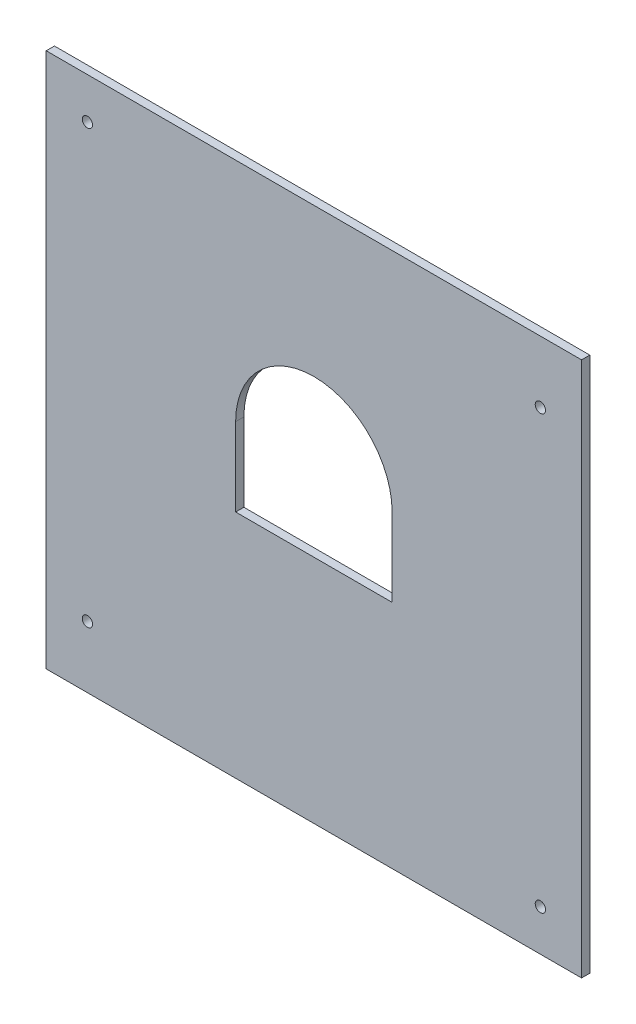
ISO-10303-21;
HEADER;
FILE_DESCRIPTION(('STEP AP214'),'2;1');
FILE_NAME('part.step','',(''),(''),'','','');
FILE_SCHEMA(('AUTOMOTIVE_DESIGN { 1 0 10303 214 1 1 1 1 }'));
ENDSEC;
DATA;
#1=APPLICATION_CONTEXT('core data for automotive mechanical design processes');
#2=APPLICATION_PROTOCOL_DEFINITION('international standard','automotive_design',2000,#1);
#3=PRODUCT_CONTEXT('',#1,'mechanical');
#4=PRODUCT('Part','Part','',(#3));
#5=PRODUCT_RELATED_PRODUCT_CATEGORY('part','',(#4));
#6=PRODUCT_DEFINITION_FORMATION('','',#4);
#7=PRODUCT_DEFINITION_CONTEXT('part definition',#1,'design');
#8=PRODUCT_DEFINITION('design','',#6,#7);
#9=PRODUCT_DEFINITION_SHAPE('','',#8);
#10=(LENGTH_UNIT() NAMED_UNIT(*) SI_UNIT(.MILLI.,.METRE.));
#11=(NAMED_UNIT(*) PLANE_ANGLE_UNIT() SI_UNIT($,.RADIAN.));
#12=(NAMED_UNIT(*) SI_UNIT($,.STERADIAN.) SOLID_ANGLE_UNIT());
#13=UNCERTAINTY_MEASURE_WITH_UNIT(LENGTH_MEASURE(1.E-05),#10,'distance_accuracy_value','');
#14=(GEOMETRIC_REPRESENTATION_CONTEXT(3) GLOBAL_UNCERTAINTY_ASSIGNED_CONTEXT((#13)) GLOBAL_UNIT_ASSIGNED_CONTEXT((#10,
#11,#12)) REPRESENTATION_CONTEXT('',''));
#15=CARTESIAN_POINT('',(0.,0.,0.));
#16=DIRECTION('',(0.,0.,1.));
#17=DIRECTION('',(1.,0.,0.));
#18=AXIS2_PLACEMENT_3D('',#15,#16,#17);
#19=CARTESIAN_POINT('',(0.,0.,2.));
#20=DIRECTION('',(0.,0.,-1.));
#21=DIRECTION('',(-1.,0.,0.));
#22=AXIS2_PLACEMENT_3D('',#19,#20,#21);
#23=PLANE('',#22);
#24=DIRECTION('',(0.,1.,0.));
#25=VECTOR('',#24,1.);
#26=CARTESIAN_POINT('',(65.,-65.,2.));
#27=LINE('',#26,#25);
#28=CARTESIAN_POINT('',(65.,-65.,2.));
#29=VERTEX_POINT('',#28);
#30=CARTESIAN_POINT('',(65.,65.,2.));
#31=VERTEX_POINT('',#30);
#32=EDGE_CURVE('E139',#29,#31,#27,.T.);
#33=ORIENTED_EDGE('',*,*,#32,.T.);
#34=DIRECTION('',(-1.,0.,0.));
#35=VECTOR('',#34,1.);
#36=CARTESIAN_POINT('',(-65.,65.,2.));
#37=LINE('',#36,#35);
#38=CARTESIAN_POINT('',(-65.,65.,2.));
#39=VERTEX_POINT('',#38);
#40=EDGE_CURVE('E142',#31,#39,#37,.T.);
#41=ORIENTED_EDGE('',*,*,#40,.T.);
#42=DIRECTION('',(0.,-1.,0.));
#43=VECTOR('',#42,1.);
#44=CARTESIAN_POINT('',(-65.,-65.,2.));
#45=LINE('',#44,#43);
#46=CARTESIAN_POINT('',(-65.,-65.,2.));
#47=VERTEX_POINT('',#46);
#48=EDGE_CURVE('E145',#39,#47,#45,.T.);
#49=ORIENTED_EDGE('',*,*,#48,.T.);
#50=DIRECTION('',(1.,0.,0.));
#51=VECTOR('',#50,1.);
#52=CARTESIAN_POINT('',(-65.,-65.,2.));
#53=LINE('',#52,#51);
#54=EDGE_CURVE('E147',#47,#29,#53,.T.);
#55=ORIENTED_EDGE('',*,*,#54,.T.);
#56=EDGE_LOOP('',(#33,#41,#49,#55));
#57=FACE_BOUND('',#56,.T.);
#58=CARTESIAN_POINT('',(1.10504890307728E-06,10.0000015377998,2.));
#59=DIRECTION('',(0.,0.,1.));
#60=DIRECTION('',(-1.,0.,0.));
#61=AXIS2_PLACEMENT_3D('',#58,#59,#60);
#62=CIRCLE('',#61,18.9999998235491);
#63=CARTESIAN_POINT('',(19.000000928598,10.0000015377998,2.));
#64=VERTEX_POINT('',#63);
#65=CARTESIAN_POINT('',(-18.9999987185002,10.0000015377998,2.));
#66=VERTEX_POINT('',#65);
#67=EDGE_CURVE('E100',#64,#66,#62,.T.);
#68=ORIENTED_EDGE('',*,*,#67,.F.);
#69=DIRECTION('',(0.,1.,0.));
#70=VECTOR('',#69,1.);
#71=CARTESIAN_POINT('',(19.000000928598,-9.0000071644783,2.));
#72=LINE('',#71,#70);
#73=CARTESIAN_POINT('',(19.000000928598,-9.0000071644783,2.));
#74=VERTEX_POINT('',#73);
#75=EDGE_CURVE('E123',#74,#64,#72,.T.);
#76=ORIENTED_EDGE('',*,*,#75,.F.);
#77=DIRECTION('',(1.,0.,0.));
#78=VECTOR('',#77,1.);
#79=CARTESIAN_POINT('',(-18.9999987185002,-9.0000071644783,2.));
#80=LINE('',#79,#78);
#81=CARTESIAN_POINT('',(-18.9999987185002,-9.0000071644783,2.));
#82=VERTEX_POINT('',#81);
#83=EDGE_CURVE('E121',#82,#74,#80,.T.);
#84=ORIENTED_EDGE('',*,*,#83,.F.);
#85=DIRECTION('',(0.,-1.,0.));
#86=VECTOR('',#85,1.);
#87=CARTESIAN_POINT('',(-18.9999987185002,10.0000015377998,2.));
#88=LINE('',#87,#86);
#89=EDGE_CURVE('E108',#66,#82,#88,.T.);
#90=ORIENTED_EDGE('',*,*,#89,.F.);
#91=EDGE_LOOP('',(#68,#76,#84,#90));
#92=FACE_BOUND('',#91,.T.);
#93=CARTESIAN_POINT('',(-55.,55.,2.));
#94=DIRECTION('',(0.,0.,1.));
#95=DIRECTION('',(1.,0.,0.));
#96=AXIS2_PLACEMENT_3D('',#93,#94,#95);
#97=CIRCLE('',#96,1.25);
#98=CARTESIAN_POINT('',(-53.75,55.,2.));
#99=VERTEX_POINT('',#98);
#100=EDGE_CURVE('E129',#99,#99,#97,.T.);
#101=ORIENTED_EDGE('',*,*,#100,.F.);
#102=EDGE_LOOP('',(#101));
#103=FACE_BOUND('',#102,.T.);
#104=CARTESIAN_POINT('',(55.,50.,2.));
#105=DIRECTION('',(0.,0.,1.));
#106=DIRECTION('',(1.,0.,0.));
#107=AXIS2_PLACEMENT_3D('',#104,#105,#106);
#108=CIRCLE('',#107,1.25);
#109=CARTESIAN_POINT('',(56.25,50.,2.));
#110=VERTEX_POINT('',#109);
#111=EDGE_CURVE('E251',#110,#110,#108,.T.);
#112=ORIENTED_EDGE('',*,*,#111,.F.);
#113=EDGE_LOOP('',(#112));
#114=FACE_BOUND('',#113,.T.);
#115=CARTESIAN_POINT('',(55.,-55.,2.));
#116=DIRECTION('',(0.,0.,1.));
#117=DIRECTION('',(1.,0.,0.));
#118=AXIS2_PLACEMENT_3D('',#115,#116,#117);
#119=CIRCLE('',#118,1.25);
#120=CARTESIAN_POINT('',(56.25,-55.,2.));
#121=VERTEX_POINT('',#120);
#122=EDGE_CURVE('E245',#121,#121,#119,.T.);
#123=ORIENTED_EDGE('',*,*,#122,.F.);
#124=EDGE_LOOP('',(#123));
#125=FACE_BOUND('',#124,.T.);
#126=CARTESIAN_POINT('',(-55.,-50.,2.));
#127=DIRECTION('',(0.,0.,1.));
#128=DIRECTION('',(1.,0.,0.));
#129=AXIS2_PLACEMENT_3D('',#126,#127,#128);
#130=CIRCLE('',#129,1.25);
#131=CARTESIAN_POINT('',(-53.75,-50.,2.));
#132=VERTEX_POINT('',#131);
#133=EDGE_CURVE('E236',#132,#132,#130,.T.);
#134=ORIENTED_EDGE('',*,*,#133,.F.);
#135=EDGE_LOOP('',(#134));
#136=FACE_BOUND('',#135,.T.);
#137=ADVANCED_FACE('F35',(#57,#92,#103,#114,#125,#136),#23,.F.);
#138=CARTESIAN_POINT('',(0.,0.,0.));
#139=DIRECTION('',(0.,0.,-1.));
#140=DIRECTION('',(-1.,0.,0.));
#141=AXIS2_PLACEMENT_3D('',#138,#139,#140);
#142=PLANE('',#141);
#143=CARTESIAN_POINT('',(55.,-55.,0.));
#144=DIRECTION('',(0.,0.,1.));
#145=DIRECTION('',(1.,0.,0.));
#146=AXIS2_PLACEMENT_3D('',#143,#144,#145);
#147=CIRCLE('',#146,1.25);
#148=CARTESIAN_POINT('',(56.25,-55.,0.));
#149=VERTEX_POINT('',#148);
#150=EDGE_CURVE('E242',#149,#149,#147,.T.);
#151=ORIENTED_EDGE('',*,*,#150,.T.);
#152=EDGE_LOOP('',(#151));
#153=FACE_BOUND('',#152,.T.);
#154=CARTESIAN_POINT('',(-55.,55.,0.));
#155=DIRECTION('',(0.,0.,1.));
#156=DIRECTION('',(1.,0.,0.));
#157=AXIS2_PLACEMENT_3D('',#154,#155,#156);
#158=CIRCLE('',#157,1.25);
#159=CARTESIAN_POINT('',(-53.75,55.,0.));
#160=VERTEX_POINT('',#159);
#161=EDGE_CURVE('E254',#160,#160,#158,.T.);
#162=ORIENTED_EDGE('',*,*,#161,.T.);
#163=EDGE_LOOP('',(#162));
#164=FACE_BOUND('',#163,.T.);
#165=DIRECTION('',(0.,1.,0.));
#166=VECTOR('',#165,1.);
#167=CARTESIAN_POINT('',(65.,-65.,0.));
#168=LINE('',#167,#166);
#169=CARTESIAN_POINT('',(65.,-65.,0.));
#170=VERTEX_POINT('',#169);
#171=CARTESIAN_POINT('',(65.,65.,0.));
#172=VERTEX_POINT('',#171);
#173=EDGE_CURVE('E116',#170,#172,#168,.T.);
#174=ORIENTED_EDGE('',*,*,#173,.F.);
#175=DIRECTION('',(1.,0.,0.));
#176=VECTOR('',#175,1.);
#177=CARTESIAN_POINT('',(-65.,-65.,0.));
#178=LINE('',#177,#176);
#179=CARTESIAN_POINT('',(-65.,-65.,0.));
#180=VERTEX_POINT('',#179);
#181=EDGE_CURVE('E143',#180,#170,#178,.T.);
#182=ORIENTED_EDGE('',*,*,#181,.F.);
#183=DIRECTION('',(0.,-1.,0.));
#184=VECTOR('',#183,1.);
#185=CARTESIAN_POINT('',(-65.,-65.,0.));
#186=LINE('',#185,#184);
#187=CARTESIAN_POINT('',(-65.,65.,0.));
#188=VERTEX_POINT('',#187);
#189=EDGE_CURVE('E154',#188,#180,#186,.T.);
#190=ORIENTED_EDGE('',*,*,#189,.F.);
#191=DIRECTION('',(-1.,0.,0.));
#192=VECTOR('',#191,1.);
#193=CARTESIAN_POINT('',(-65.,65.,0.));
#194=LINE('',#193,#192);
#195=EDGE_CURVE('E152',#172,#188,#194,.T.);
#196=ORIENTED_EDGE('',*,*,#195,.F.);
#197=EDGE_LOOP('',(#174,#182,#190,#196));
#198=FACE_BOUND('',#197,.T.);
#199=DIRECTION('',(0.,1.,0.));
#200=VECTOR('',#199,1.);
#201=CARTESIAN_POINT('',(19.000000928598,-9.0000071644783,0.));
#202=LINE('',#201,#200);
#203=CARTESIAN_POINT('',(19.000000928598,-9.0000071644783,0.));
#204=VERTEX_POINT('',#203);
#205=CARTESIAN_POINT('',(19.000000928598,10.0000015377998,0.));
#206=VERTEX_POINT('',#205);
#207=EDGE_CURVE('E109',#204,#206,#202,.T.);
#208=ORIENTED_EDGE('',*,*,#207,.T.);
#209=CARTESIAN_POINT('',(1.10504890307728E-06,10.0000015377998,0.));
#210=DIRECTION('',(0.,0.,1.));
#211=DIRECTION('',(-1.,0.,0.));
#212=AXIS2_PLACEMENT_3D('',#209,#210,#211);
#213=CIRCLE('',#212,18.9999998235491);
#214=CARTESIAN_POINT('',(-18.9999987185002,10.0000015377998,0.));
#215=VERTEX_POINT('',#214);
#216=EDGE_CURVE('E58',#206,#215,#213,.T.);
#217=ORIENTED_EDGE('',*,*,#216,.T.);
#218=DIRECTION('',(0.,-1.,0.));
#219=VECTOR('',#218,1.);
#220=CARTESIAN_POINT('',(-18.9999987185002,10.0000015377998,0.));
#221=LINE('',#220,#219);
#222=CARTESIAN_POINT('',(-18.9999987185002,-9.0000071644783,0.));
#223=VERTEX_POINT('',#222);
#224=EDGE_CURVE('E115',#215,#223,#221,.T.);
#225=ORIENTED_EDGE('',*,*,#224,.T.);
#226=DIRECTION('',(1.,0.,0.));
#227=VECTOR('',#226,1.);
#228=CARTESIAN_POINT('',(-18.9999987185002,-9.0000071644783,0.));
#229=LINE('',#228,#227);
#230=EDGE_CURVE('E131',#223,#204,#229,.T.);
#231=ORIENTED_EDGE('',*,*,#230,.T.);
#232=EDGE_LOOP('',(#208,#217,#225,#231));
#233=FACE_BOUND('',#232,.T.);
#234=CARTESIAN_POINT('',(55.,50.,0.));
#235=DIRECTION('',(0.,0.,1.));
#236=DIRECTION('',(1.,0.,0.));
#237=AXIS2_PLACEMENT_3D('',#234,#235,#236);
#238=CIRCLE('',#237,1.25);
#239=CARTESIAN_POINT('',(56.25,50.,0.));
#240=VERTEX_POINT('',#239);
#241=EDGE_CURVE('E248',#240,#240,#238,.T.);
#242=ORIENTED_EDGE('',*,*,#241,.T.);
#243=EDGE_LOOP('',(#242));
#244=FACE_BOUND('',#243,.T.);
#245=CARTESIAN_POINT('',(-55.,-50.,0.));
#246=DIRECTION('',(0.,0.,1.));
#247=DIRECTION('',(1.,0.,0.));
#248=AXIS2_PLACEMENT_3D('',#245,#246,#247);
#249=CIRCLE('',#248,1.25);
#250=CARTESIAN_POINT('',(-53.75,-50.,0.));
#251=VERTEX_POINT('',#250);
#252=EDGE_CURVE('E239',#251,#251,#249,.T.);
#253=ORIENTED_EDGE('',*,*,#252,.T.);
#254=EDGE_LOOP('',(#253));
#255=FACE_BOUND('',#254,.T.);
#256=ADVANCED_FACE('F172',(#153,#164,#198,#233,#244,#255),#142,.T.);
#257=CARTESIAN_POINT('',(65.,-65.,2.));
#258=DIRECTION('',(-1.,0.,0.));
#259=DIRECTION('',(0.,0.,1.));
#260=AXIS2_PLACEMENT_3D('',#257,#258,#259);
#261=PLANE('',#260);
#262=ORIENTED_EDGE('',*,*,#173,.T.);
#263=DIRECTION('',(0.,0.,-1.));
#264=VECTOR('',#263,1.);
#265=CARTESIAN_POINT('',(65.,65.,2.));
#266=LINE('',#265,#264);
#267=EDGE_CURVE('E11',#31,#172,#266,.T.);
#268=ORIENTED_EDGE('',*,*,#267,.F.);
#269=ORIENTED_EDGE('',*,*,#32,.F.);
#270=DIRECTION('',(0.,0.,-1.));
#271=VECTOR('',#270,1.);
#272=CARTESIAN_POINT('',(65.,-65.,2.));
#273=LINE('',#272,#271);
#274=EDGE_CURVE('E149',#29,#170,#273,.T.);
#275=ORIENTED_EDGE('',*,*,#274,.T.);
#276=EDGE_LOOP('',(#262,#268,#269,#275));
#277=FACE_BOUND('',#276,.T.);
#278=ADVANCED_FACE('F37',(#277),#261,.F.);
#279=CARTESIAN_POINT('',(-65.,65.,2.));
#280=DIRECTION('',(0.,-1.,0.));
#281=DIRECTION('',(0.,0.,-1.));
#282=AXIS2_PLACEMENT_3D('',#279,#280,#281);
#283=PLANE('',#282);
#284=ORIENTED_EDGE('',*,*,#195,.T.);
#285=DIRECTION('',(0.,0.,-1.));
#286=VECTOR('',#285,1.);
#287=CARTESIAN_POINT('',(-65.,65.,2.));
#288=LINE('',#287,#286);
#289=EDGE_CURVE('E43',#39,#188,#288,.T.);
#290=ORIENTED_EDGE('',*,*,#289,.F.);
#291=ORIENTED_EDGE('',*,*,#40,.F.);
#292=ORIENTED_EDGE('',*,*,#267,.T.);
#293=EDGE_LOOP('',(#284,#290,#291,#292));
#294=FACE_BOUND('',#293,.T.);
#295=ADVANCED_FACE('F182',(#294),#283,.F.);
#296=CARTESIAN_POINT('',(-65.,-65.,2.));
#297=DIRECTION('',(1.,0.,0.));
#298=DIRECTION('',(0.,0.,-1.));
#299=AXIS2_PLACEMENT_3D('',#296,#297,#298);
#300=PLANE('',#299);
#301=ORIENTED_EDGE('',*,*,#189,.T.);
#302=DIRECTION('',(0.,0.,-1.));
#303=VECTOR('',#302,1.);
#304=CARTESIAN_POINT('',(-65.,-65.,2.));
#305=LINE('',#304,#303);
#306=EDGE_CURVE('E159',#47,#180,#305,.T.);
#307=ORIENTED_EDGE('',*,*,#306,.F.);
#308=ORIENTED_EDGE('',*,*,#48,.F.);
#309=ORIENTED_EDGE('',*,*,#289,.T.);
#310=EDGE_LOOP('',(#301,#307,#308,#309));
#311=FACE_BOUND('',#310,.T.);
#312=ADVANCED_FACE('F166',(#311),#300,.F.);
#313=CARTESIAN_POINT('',(-65.,-65.,2.));
#314=DIRECTION('',(0.,1.,0.));
#315=DIRECTION('',(0.,0.,1.));
#316=AXIS2_PLACEMENT_3D('',#313,#314,#315);
#317=PLANE('',#316);
#318=ORIENTED_EDGE('',*,*,#181,.T.);
#319=ORIENTED_EDGE('',*,*,#274,.F.);
#320=ORIENTED_EDGE('',*,*,#54,.F.);
#321=ORIENTED_EDGE('',*,*,#306,.T.);
#322=EDGE_LOOP('',(#318,#319,#320,#321));
#323=FACE_BOUND('',#322,.T.);
#324=ADVANCED_FACE('F176',(#323),#317,.F.);
#325=CARTESIAN_POINT('',(1.10504890307728E-06,10.0000015377998,2.));
#326=DIRECTION('',(0.,0.,-1.));
#327=DIRECTION('',(-1.,0.,0.));
#328=AXIS2_PLACEMENT_3D('',#325,#326,#327);
#329=CYLINDRICAL_SURFACE('',#328,18.9999998235491);
#330=ORIENTED_EDGE('',*,*,#216,.F.);
#331=DIRECTION('',(0.,0.,-1.));
#332=VECTOR('',#331,1.);
#333=CARTESIAN_POINT('',(19.000000928598,10.0000015377998,2.));
#334=LINE('',#333,#332);
#335=EDGE_CURVE('E104',#64,#206,#334,.T.);
#336=ORIENTED_EDGE('',*,*,#335,.F.);
#337=ORIENTED_EDGE('',*,*,#67,.T.);
#338=DIRECTION('',(0.,0.,-1.));
#339=VECTOR('',#338,1.);
#340=CARTESIAN_POINT('',(-18.9999987185002,10.0000015377998,2.));
#341=LINE('',#340,#339);
#342=EDGE_CURVE('E103',#66,#215,#341,.T.);
#343=ORIENTED_EDGE('',*,*,#342,.T.);
#344=EDGE_LOOP('',(#330,#336,#337,#343));
#345=FACE_BOUND('',#344,.T.);
#346=ADVANCED_FACE('F102',(#345),#329,.F.);
#347=CARTESIAN_POINT('',(-18.9999987185002,10.0000015377998,2.));
#348=DIRECTION('',(1.,0.,0.));
#349=DIRECTION('',(0.,0.,-1.));
#350=AXIS2_PLACEMENT_3D('',#347,#348,#349);
#351=PLANE('',#350);
#352=ORIENTED_EDGE('',*,*,#224,.F.);
#353=ORIENTED_EDGE('',*,*,#342,.F.);
#354=ORIENTED_EDGE('',*,*,#89,.T.);
#355=DIRECTION('',(0.,0.,-1.));
#356=VECTOR('',#355,1.);
#357=CARTESIAN_POINT('',(-18.9999987185002,-9.0000071644783,2.));
#358=LINE('',#357,#356);
#359=EDGE_CURVE('E117',#82,#223,#358,.T.);
#360=ORIENTED_EDGE('',*,*,#359,.T.);
#361=EDGE_LOOP('',(#352,#353,#354,#360));
#362=FACE_BOUND('',#361,.T.);
#363=ADVANCED_FACE('F112',(#362),#351,.T.);
#364=CARTESIAN_POINT('',(-18.9999987185002,-9.0000071644783,2.));
#365=DIRECTION('',(0.,1.,0.));
#366=DIRECTION('',(0.,0.,1.));
#367=AXIS2_PLACEMENT_3D('',#364,#365,#366);
#368=PLANE('',#367);
#369=ORIENTED_EDGE('',*,*,#230,.F.);
#370=ORIENTED_EDGE('',*,*,#359,.F.);
#371=ORIENTED_EDGE('',*,*,#83,.T.);
#372=DIRECTION('',(0.,0.,-1.));
#373=VECTOR('',#372,1.);
#374=CARTESIAN_POINT('',(19.000000928598,-9.0000071644783,2.));
#375=LINE('',#374,#373);
#376=EDGE_CURVE('E50',#74,#204,#375,.T.);
#377=ORIENTED_EDGE('',*,*,#376,.T.);
#378=EDGE_LOOP('',(#369,#370,#371,#377));
#379=FACE_BOUND('',#378,.T.);
#380=ADVANCED_FACE('F206',(#379),#368,.T.);
#381=CARTESIAN_POINT('',(19.000000928598,-9.0000071644783,2.));
#382=DIRECTION('',(-1.,0.,0.));
#383=DIRECTION('',(0.,0.,1.));
#384=AXIS2_PLACEMENT_3D('',#381,#382,#383);
#385=PLANE('',#384);
#386=ORIENTED_EDGE('',*,*,#207,.F.);
#387=ORIENTED_EDGE('',*,*,#376,.F.);
#388=ORIENTED_EDGE('',*,*,#75,.T.);
#389=ORIENTED_EDGE('',*,*,#335,.T.);
#390=EDGE_LOOP('',(#386,#387,#388,#389));
#391=FACE_BOUND('',#390,.T.);
#392=ADVANCED_FACE('F210',(#391),#385,.T.);
#393=CARTESIAN_POINT('',(-55.,55.,2.));
#394=DIRECTION('',(0.,0.,-1.));
#395=DIRECTION('',(-1.,0.,0.));
#396=AXIS2_PLACEMENT_3D('',#393,#394,#395);
#397=CYLINDRICAL_SURFACE('',#396,1.25);
#398=ORIENTED_EDGE('',*,*,#100,.T.);
#399=EDGE_LOOP('',(#398));
#400=FACE_BOUND('',#399,.T.);
#401=ORIENTED_EDGE('',*,*,#161,.F.);
#402=EDGE_LOOP('',(#401));
#403=FACE_BOUND('',#402,.T.);
#404=ADVANCED_FACE('F216',(#400,#403),#397,.F.);
#405=CARTESIAN_POINT('',(55.,50.,2.));
#406=DIRECTION('',(0.,0.,-1.));
#407=DIRECTION('',(-1.,0.,0.));
#408=AXIS2_PLACEMENT_3D('',#405,#406,#407);
#409=CYLINDRICAL_SURFACE('',#408,1.25);
#410=ORIENTED_EDGE('',*,*,#111,.T.);
#411=EDGE_LOOP('',(#410));
#412=FACE_BOUND('',#411,.T.);
#413=ORIENTED_EDGE('',*,*,#241,.F.);
#414=EDGE_LOOP('',(#413));
#415=FACE_BOUND('',#414,.T.);
#416=ADVANCED_FACE('F219',(#412,#415),#409,.F.);
#417=CARTESIAN_POINT('',(55.,-55.,2.));
#418=DIRECTION('',(0.,0.,-1.));
#419=DIRECTION('',(-1.,0.,0.));
#420=AXIS2_PLACEMENT_3D('',#417,#418,#419);
#421=CYLINDRICAL_SURFACE('',#420,1.25);
#422=ORIENTED_EDGE('',*,*,#122,.T.);
#423=EDGE_LOOP('',(#422));
#424=FACE_BOUND('',#423,.T.);
#425=ORIENTED_EDGE('',*,*,#150,.F.);
#426=EDGE_LOOP('',(#425));
#427=FACE_BOUND('',#426,.T.);
#428=ADVANCED_FACE('F223',(#424,#427),#421,.F.);
#429=CARTESIAN_POINT('',(-55.,-50.,2.));
#430=DIRECTION('',(0.,0.,-1.));
#431=DIRECTION('',(-1.,0.,0.));
#432=AXIS2_PLACEMENT_3D('',#429,#430,#431);
#433=CYLINDRICAL_SURFACE('',#432,1.25);
#434=ORIENTED_EDGE('',*,*,#133,.T.);
#435=EDGE_LOOP('',(#434));
#436=FACE_BOUND('',#435,.T.);
#437=ORIENTED_EDGE('',*,*,#252,.F.);
#438=EDGE_LOOP('',(#437));
#439=FACE_BOUND('',#438,.T.);
#440=ADVANCED_FACE('F227',(#436,#439),#433,.F.);
#441=CLOSED_SHELL('',(#137,#256,#278,#295,#312,#324,#346,#363,#380,#392,#404,#416,#428,#440));
#442=MANIFOLD_SOLID_BREP('B2',#441);
#443=ADVANCED_BREP_SHAPE_REPRESENTATION('',(#18,#442),#14);
#444=SHAPE_DEFINITION_REPRESENTATION(#9,#443);
ENDSEC;
END-ISO-10303-21;
